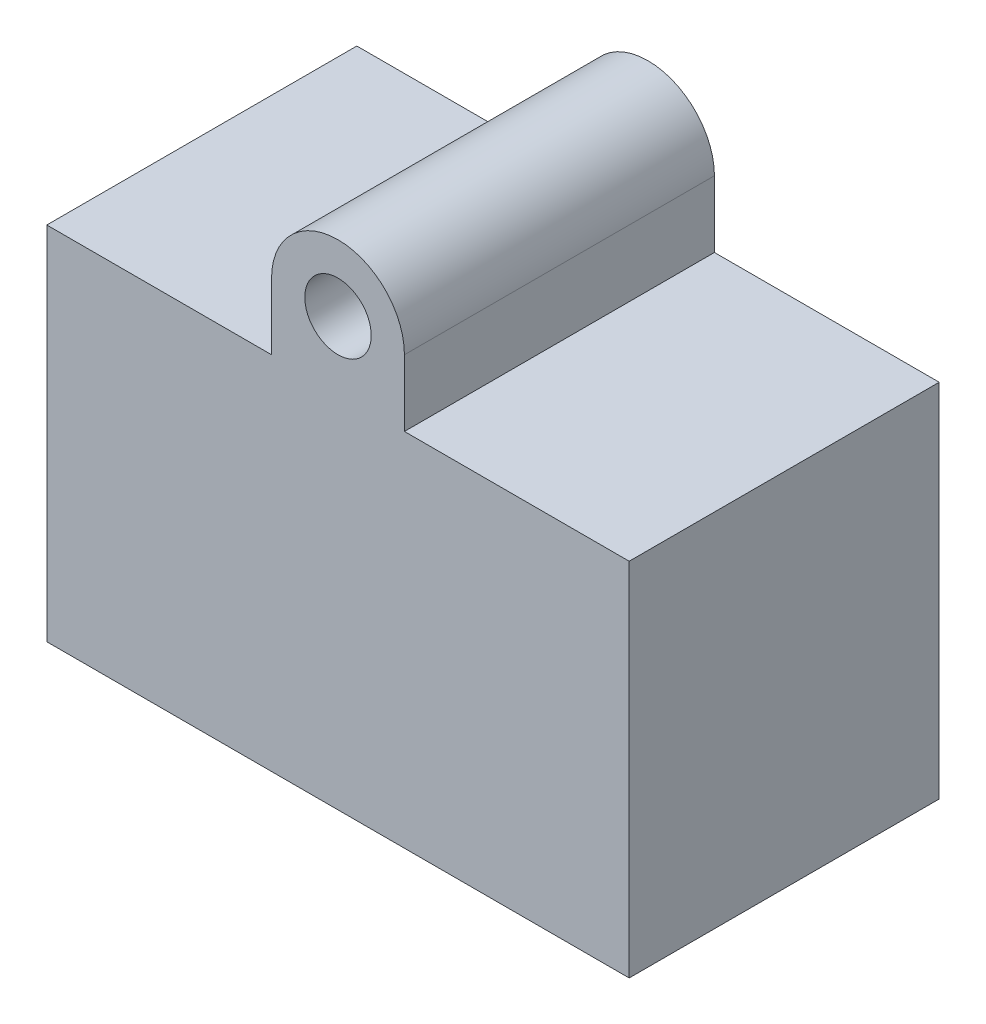
ISO-10303-21;
HEADER;
FILE_DESCRIPTION(('STEP AP214'),'2;1');
FILE_NAME('part.step','',(''),(''),'','','');
FILE_SCHEMA(('AUTOMOTIVE_DESIGN { 1 0 10303 214 1 1 1 1 }'));
ENDSEC;
DATA;
#1=APPLICATION_CONTEXT('core data for automotive mechanical design processes');
#2=APPLICATION_PROTOCOL_DEFINITION('international standard','automotive_design',2000,#1);
#3=PRODUCT_CONTEXT('',#1,'mechanical');
#4=PRODUCT('Part','Part','',(#3));
#5=PRODUCT_RELATED_PRODUCT_CATEGORY('part','',(#4));
#6=PRODUCT_DEFINITION_FORMATION('','',#4);
#7=PRODUCT_DEFINITION_CONTEXT('part definition',#1,'design');
#8=PRODUCT_DEFINITION('design','',#6,#7);
#9=PRODUCT_DEFINITION_SHAPE('','',#8);
#10=(LENGTH_UNIT() NAMED_UNIT(*) SI_UNIT(.MILLI.,.METRE.));
#11=(NAMED_UNIT(*) PLANE_ANGLE_UNIT() SI_UNIT($,.RADIAN.));
#12=(NAMED_UNIT(*) SI_UNIT($,.STERADIAN.) SOLID_ANGLE_UNIT());
#13=UNCERTAINTY_MEASURE_WITH_UNIT(LENGTH_MEASURE(1.E-05),#10,'distance_accuracy_value','');
#14=(GEOMETRIC_REPRESENTATION_CONTEXT(3) GLOBAL_UNCERTAINTY_ASSIGNED_CONTEXT((#13)) GLOBAL_UNIT_ASSIGNED_CONTEXT((#10,
#11,#12)) REPRESENTATION_CONTEXT('',''));
#15=CARTESIAN_POINT('',(0.,0.,0.));
#16=DIRECTION('',(0.,0.,1.));
#17=DIRECTION('',(1.,0.,0.));
#18=AXIS2_PLACEMENT_3D('',#15,#16,#17);
#19=CARTESIAN_POINT('',(5.07,2.575,7.));
#20=DIRECTION('',(-1.,0.,0.));
#21=DIRECTION('',(0.,0.,1.));
#22=AXIS2_PLACEMENT_3D('',#19,#20,#21);
#23=PLANE('',#22);
#24=DIRECTION('',(0.,0.,-1.));
#25=VECTOR('',#24,1.);
#26=CARTESIAN_POINT('',(5.07,-2.575,7.));
#27=LINE('',#26,#25);
#28=CARTESIAN_POINT('',(5.07,-2.575,5.));
#29=VERTEX_POINT('',#28);
#30=CARTESIAN_POINT('',(5.07,-2.575,0.));
#31=VERTEX_POINT('',#30);
#32=EDGE_CURVE('E60',#29,#31,#27,.T.);
#33=ORIENTED_EDGE('',*,*,#32,.F.);
#34=DIRECTION('',(0.,1.,0.));
#35=VECTOR('',#34,1.);
#36=CARTESIAN_POINT('',(5.07,2.575,5.));
#37=LINE('',#36,#35);
#38=CARTESIAN_POINT('',(5.07,2.575,5.));
#39=VERTEX_POINT('',#38);
#40=EDGE_CURVE('E54',#29,#39,#37,.T.);
#41=ORIENTED_EDGE('',*,*,#40,.T.);
#42=DIRECTION('',(0.,0.,-1.));
#43=VECTOR('',#42,1.);
#44=CARTESIAN_POINT('',(5.07,2.575,7.));
#45=LINE('',#44,#43);
#46=CARTESIAN_POINT('',(5.07,2.575,0.));
#47=VERTEX_POINT('',#46);
#48=EDGE_CURVE('E143',#39,#47,#45,.T.);
#49=ORIENTED_EDGE('',*,*,#48,.T.);
#50=DIRECTION('',(0.,1.,0.));
#51=VECTOR('',#50,1.);
#52=CARTESIAN_POINT('',(5.07,2.575,0.));
#53=LINE('',#52,#51);
#54=EDGE_CURVE('E253',#31,#47,#53,.T.);
#55=ORIENTED_EDGE('',*,*,#54,.F.);
#56=EDGE_LOOP('',(#33,#41,#49,#55));
#57=FACE_BOUND('',#56,.T.);
#58=ADVANCED_FACE('F39',(#57),#23,.T.);
#59=CARTESIAN_POINT('',(-5.08,2.575,7.));
#60=DIRECTION('',(0.,-1.,0.));
#61=DIRECTION('',(0.,0.,-1.));
#62=AXIS2_PLACEMENT_3D('',#59,#60,#61);
#63=PLANE('',#62);
#64=ORIENTED_EDGE('',*,*,#48,.F.);
#65=DIRECTION('',(-1.,0.,0.));
#66=VECTOR('',#65,1.);
#67=CARTESIAN_POINT('',(-5.08,2.575,5.));
#68=LINE('',#67,#66);
#69=CARTESIAN_POINT('',(-5.08,2.575,5.));
#70=VERTEX_POINT('',#69);
#71=EDGE_CURVE('E136',#39,#70,#68,.T.);
#72=ORIENTED_EDGE('',*,*,#71,.T.);
#73=DIRECTION('',(0.,0.,-1.));
#74=VECTOR('',#73,1.);
#75=CARTESIAN_POINT('',(-5.08,2.575,7.));
#76=LINE('',#75,#74);
#77=CARTESIAN_POINT('',(-5.08,2.575,0.));
#78=VERTEX_POINT('',#77);
#79=EDGE_CURVE('E135',#70,#78,#76,.T.);
#80=ORIENTED_EDGE('',*,*,#79,.T.);
#81=DIRECTION('',(-1.,0.,0.));
#82=VECTOR('',#81,1.);
#83=CARTESIAN_POINT('',(-5.08,2.575,0.));
#84=LINE('',#83,#82);
#85=EDGE_CURVE('E257',#47,#78,#84,.T.);
#86=ORIENTED_EDGE('',*,*,#85,.F.);
#87=EDGE_LOOP('',(#64,#72,#80,#86));
#88=FACE_BOUND('',#87,.T.);
#89=ADVANCED_FACE('F271',(#88),#63,.T.);
#90=CARTESIAN_POINT('',(-5.08,2.575,7.));
#91=DIRECTION('',(1.,0.,0.));
#92=DIRECTION('',(0.,0.,-1.));
#93=AXIS2_PLACEMENT_3D('',#90,#91,#92);
#94=PLANE('',#93);
#95=ORIENTED_EDGE('',*,*,#79,.F.);
#96=DIRECTION('',(0.,-1.,0.));
#97=VECTOR('',#96,1.);
#98=CARTESIAN_POINT('',(-5.08,2.575,5.));
#99=LINE('',#98,#97);
#100=CARTESIAN_POINT('',(-5.08,-2.575,5.));
#101=VERTEX_POINT('',#100);
#102=EDGE_CURVE('E127',#70,#101,#99,.T.);
#103=ORIENTED_EDGE('',*,*,#102,.T.);
#104=DIRECTION('',(0.,0.,-1.));
#105=VECTOR('',#104,1.);
#106=CARTESIAN_POINT('',(-5.08,-2.575,7.));
#107=LINE('',#106,#105);
#108=CARTESIAN_POINT('',(-5.08,-2.575,0.));
#109=VERTEX_POINT('',#108);
#110=EDGE_CURVE('E134',#101,#109,#107,.T.);
#111=ORIENTED_EDGE('',*,*,#110,.T.);
#112=DIRECTION('',(0.,-1.,0.));
#113=VECTOR('',#112,1.);
#114=CARTESIAN_POINT('',(-5.08,2.575,0.));
#115=LINE('',#114,#113);
#116=EDGE_CURVE('E266',#78,#109,#115,.T.);
#117=ORIENTED_EDGE('',*,*,#116,.F.);
#118=EDGE_LOOP('',(#95,#103,#111,#117));
#119=FACE_BOUND('',#118,.T.);
#120=ADVANCED_FACE('F132',(#119),#94,.T.);
#121=CARTESIAN_POINT('',(-5.08,-2.575,7.));
#122=DIRECTION('',(0.,1.,0.));
#123=DIRECTION('',(0.,0.,1.));
#124=AXIS2_PLACEMENT_3D('',#121,#122,#123);
#125=PLANE('',#124);
#126=ORIENTED_EDGE('',*,*,#110,.F.);
#127=DIRECTION('',(1.,0.,0.));
#128=VECTOR('',#127,1.);
#129=CARTESIAN_POINT('',(-5.08,-2.575,5.));
#130=LINE('',#129,#128);
#131=EDGE_CURVE('E11',#101,#29,#130,.T.);
#132=ORIENTED_EDGE('',*,*,#131,.T.);
#133=ORIENTED_EDGE('',*,*,#32,.T.);
#134=DIRECTION('',(1.,0.,0.));
#135=VECTOR('',#134,1.);
#136=CARTESIAN_POINT('',(-5.08,-2.575,0.));
#137=LINE('',#136,#135);
#138=EDGE_CURVE('E140',#109,#31,#137,.T.);
#139=ORIENTED_EDGE('',*,*,#138,.F.);
#140=EDGE_LOOP('',(#126,#132,#133,#139));
#141=FACE_BOUND('',#140,.T.);
#142=ADVANCED_FACE('F138',(#141),#125,.T.);
#143=CARTESIAN_POINT('',(-0.0049999999999998,5.575,7.));
#144=DIRECTION('',(0.,0.,1.));
#145=DIRECTION('',(1.,0.,0.));
#146=AXIS2_PLACEMENT_3D('',#143,#144,#145);
#147=PLANE('',#146);
#148=DIRECTION('',(0.,-1.,0.));
#149=VECTOR('',#148,1.);
#150=CARTESIAN_POINT('',(-1.505,5.575,7.));
#151=LINE('',#150,#149);
#152=CARTESIAN_POINT('',(-1.505,5.575,7.));
#153=VERTEX_POINT('',#152);
#154=CARTESIAN_POINT('',(-1.505,4.075,7.));
#155=VERTEX_POINT('',#154);
#156=EDGE_CURVE('E164',#153,#155,#151,.T.);
#157=ORIENTED_EDGE('',*,*,#156,.T.);
#158=DIRECTION('',(-1.,0.,0.));
#159=VECTOR('',#158,1.);
#160=CARTESIAN_POINT('',(-6.58,4.075,7.));
#161=LINE('',#160,#159);
#162=CARTESIAN_POINT('',(-6.58,4.075,7.));
#163=VERTEX_POINT('',#162);
#164=EDGE_CURVE('E166',#155,#163,#161,.T.);
#165=ORIENTED_EDGE('',*,*,#164,.T.);
#166=DIRECTION('',(0.,-1.,0.));
#167=VECTOR('',#166,1.);
#168=CARTESIAN_POINT('',(-6.58,4.075,7.));
#169=LINE('',#168,#167);
#170=CARTESIAN_POINT('',(-6.58,-4.075,7.));
#171=VERTEX_POINT('',#170);
#172=EDGE_CURVE('E150',#163,#171,#169,.T.);
#173=ORIENTED_EDGE('',*,*,#172,.T.);
#174=DIRECTION('',(1.,0.,0.));
#175=VECTOR('',#174,1.);
#176=CARTESIAN_POINT('',(-6.58,-4.075,7.));
#177=LINE('',#176,#175);
#178=CARTESIAN_POINT('',(6.57,-4.075,7.));
#179=VERTEX_POINT('',#178);
#180=EDGE_CURVE('E153',#171,#179,#177,.T.);
#181=ORIENTED_EDGE('',*,*,#180,.T.);
#182=DIRECTION('',(0.,1.,0.));
#183=VECTOR('',#182,1.);
#184=CARTESIAN_POINT('',(6.57,4.075,7.));
#185=LINE('',#184,#183);
#186=CARTESIAN_POINT('',(6.57,4.075,7.));
#187=VERTEX_POINT('',#186);
#188=EDGE_CURVE('E156',#179,#187,#185,.T.);
#189=ORIENTED_EDGE('',*,*,#188,.T.);
#190=DIRECTION('',(-1.,0.,0.));
#191=VECTOR('',#190,1.);
#192=CARTESIAN_POINT('',(1.495,4.075,7.));
#193=LINE('',#192,#191);
#194=CARTESIAN_POINT('',(1.495,4.075,7.));
#195=VERTEX_POINT('',#194);
#196=EDGE_CURVE('E158',#187,#195,#193,.T.);
#197=ORIENTED_EDGE('',*,*,#196,.T.);
#198=DIRECTION('',(0.,1.,0.));
#199=VECTOR('',#198,1.);
#200=CARTESIAN_POINT('',(1.495,5.575,7.));
#201=LINE('',#200,#199);
#202=CARTESIAN_POINT('',(1.495,5.575,7.));
#203=VERTEX_POINT('',#202);
#204=EDGE_CURVE('E160',#195,#203,#201,.T.);
#205=ORIENTED_EDGE('',*,*,#204,.T.);
#206=CARTESIAN_POINT('',(-0.0049999999999998,5.575,7.));
#207=DIRECTION('',(0.,0.,1.));
#208=DIRECTION('',(1.,0.,0.));
#209=AXIS2_PLACEMENT_3D('',#206,#207,#208);
#210=CIRCLE('',#209,1.5);
#211=EDGE_CURVE('E162',#203,#153,#210,.T.);
#212=ORIENTED_EDGE('',*,*,#211,.T.);
#213=EDGE_LOOP('',(#157,#165,#173,#181,#189,#197,#205,#212));
#214=FACE_BOUND('',#213,.T.);
#215=CARTESIAN_POINT('',(-0.0049999999999998,5.575,7.));
#216=DIRECTION('',(0.,0.,1.));
#217=DIRECTION('',(1.,0.,0.));
#218=AXIS2_PLACEMENT_3D('',#215,#216,#217);
#219=CIRCLE('',#218,0.75);
#220=CARTESIAN_POINT('',(0.745,5.575,7.));
#221=VERTEX_POINT('',#220);
#222=EDGE_CURVE('E251',#221,#221,#219,.T.);
#223=ORIENTED_EDGE('',*,*,#222,.F.);
#224=EDGE_LOOP('',(#223));
#225=FACE_BOUND('',#224,.T.);
#226=ADVANCED_FACE('F245',(#214,#225),#147,.T.);
#227=CARTESIAN_POINT('',(-0.0049999999999998,5.575,0.));
#228=DIRECTION('',(0.,0.,1.));
#229=DIRECTION('',(1.,0.,0.));
#230=AXIS2_PLACEMENT_3D('',#227,#228,#229);
#231=PLANE('',#230);
#232=DIRECTION('',(0.,-1.,0.));
#233=VECTOR('',#232,1.);
#234=CARTESIAN_POINT('',(-6.58,4.075,0.));
#235=LINE('',#234,#233);
#236=CARTESIAN_POINT('',(-6.58,4.075,0.));
#237=VERTEX_POINT('',#236);
#238=CARTESIAN_POINT('',(-6.58,-4.075,0.));
#239=VERTEX_POINT('',#238);
#240=EDGE_CURVE('E149',#237,#239,#235,.T.);
#241=ORIENTED_EDGE('',*,*,#240,.F.);
#242=DIRECTION('',(-1.,0.,0.));
#243=VECTOR('',#242,1.);
#244=CARTESIAN_POINT('',(-6.58,4.075,0.));
#245=LINE('',#244,#243);
#246=CARTESIAN_POINT('',(-1.505,4.075,0.));
#247=VERTEX_POINT('',#246);
#248=EDGE_CURVE('E154',#247,#237,#245,.T.);
#249=ORIENTED_EDGE('',*,*,#248,.F.);
#250=DIRECTION('',(0.,-1.,0.));
#251=VECTOR('',#250,1.);
#252=CARTESIAN_POINT('',(-1.505,5.575,0.));
#253=LINE('',#252,#251);
#254=CARTESIAN_POINT('',(-1.505,5.575,0.));
#255=VERTEX_POINT('',#254);
#256=EDGE_CURVE('E184',#255,#247,#253,.T.);
#257=ORIENTED_EDGE('',*,*,#256,.F.);
#258=CARTESIAN_POINT('',(-0.0049999999999998,5.575,0.));
#259=DIRECTION('',(0.,0.,1.));
#260=DIRECTION('',(1.,0.,0.));
#261=AXIS2_PLACEMENT_3D('',#258,#259,#260);
#262=CIRCLE('',#261,1.5);
#263=CARTESIAN_POINT('',(1.495,5.575,0.));
#264=VERTEX_POINT('',#263);
#265=EDGE_CURVE('E182',#264,#255,#262,.T.);
#266=ORIENTED_EDGE('',*,*,#265,.F.);
#267=DIRECTION('',(0.,1.,0.));
#268=VECTOR('',#267,1.);
#269=CARTESIAN_POINT('',(1.495,5.575,0.));
#270=LINE('',#269,#268);
#271=CARTESIAN_POINT('',(1.495,4.075,0.));
#272=VERTEX_POINT('',#271);
#273=EDGE_CURVE('E180',#272,#264,#270,.T.);
#274=ORIENTED_EDGE('',*,*,#273,.F.);
#275=DIRECTION('',(-1.,0.,0.));
#276=VECTOR('',#275,1.);
#277=CARTESIAN_POINT('',(1.495,4.075,0.));
#278=LINE('',#277,#276);
#279=CARTESIAN_POINT('',(6.57,4.075,0.));
#280=VERTEX_POINT('',#279);
#281=EDGE_CURVE('E177',#280,#272,#278,.T.);
#282=ORIENTED_EDGE('',*,*,#281,.F.);
#283=DIRECTION('',(0.,1.,0.));
#284=VECTOR('',#283,1.);
#285=CARTESIAN_POINT('',(6.57,4.075,0.));
#286=LINE('',#285,#284);
#287=CARTESIAN_POINT('',(6.57,-4.075,0.));
#288=VERTEX_POINT('',#287);
#289=EDGE_CURVE('E174',#288,#280,#286,.T.);
#290=ORIENTED_EDGE('',*,*,#289,.F.);
#291=DIRECTION('',(1.,0.,0.));
#292=VECTOR('',#291,1.);
#293=CARTESIAN_POINT('',(-6.58,-4.075,0.));
#294=LINE('',#293,#292);
#295=EDGE_CURVE('E171',#239,#288,#294,.T.);
#296=ORIENTED_EDGE('',*,*,#295,.F.);
#297=EDGE_LOOP('',(#241,#249,#257,#266,#274,#282,#290,#296));
#298=FACE_BOUND('',#297,.T.);
#299=ORIENTED_EDGE('',*,*,#54,.T.);
#300=ORIENTED_EDGE('',*,*,#85,.T.);
#301=ORIENTED_EDGE('',*,*,#116,.T.);
#302=ORIENTED_EDGE('',*,*,#138,.T.);
#303=EDGE_LOOP('',(#299,#300,#301,#302));
#304=FACE_BOUND('',#303,.T.);
#305=CARTESIAN_POINT('',(-0.0049999999999998,5.575,0.));
#306=DIRECTION('',(0.,0.,1.));
#307=DIRECTION('',(1.,0.,0.));
#308=AXIS2_PLACEMENT_3D('',#305,#306,#307);
#309=CIRCLE('',#308,0.75);
#310=CARTESIAN_POINT('',(0.745,5.575,0.));
#311=VERTEX_POINT('',#310);
#312=EDGE_CURVE('E254',#311,#311,#309,.T.);
#313=ORIENTED_EDGE('',*,*,#312,.T.);
#314=EDGE_LOOP('',(#313));
#315=FACE_BOUND('',#314,.T.);
#316=ADVANCED_FACE('F213',(#298,#304,#315),#231,.F.);
#317=CARTESIAN_POINT('',(-6.58,4.075,7.));
#318=DIRECTION('',(1.,0.,0.));
#319=DIRECTION('',(0.,0.,-1.));
#320=AXIS2_PLACEMENT_3D('',#317,#318,#319);
#321=PLANE('',#320);
#322=DIRECTION('',(0.,0.,-1.));
#323=VECTOR('',#322,1.);
#324=CARTESIAN_POINT('',(-6.58,4.075,7.));
#325=LINE('',#324,#323);
#326=EDGE_CURVE('E168',#163,#237,#325,.T.);
#327=ORIENTED_EDGE('',*,*,#326,.T.);
#328=ORIENTED_EDGE('',*,*,#240,.T.);
#329=DIRECTION('',(0.,0.,-1.));
#330=VECTOR('',#329,1.);
#331=CARTESIAN_POINT('',(-6.58,-4.075,7.));
#332=LINE('',#331,#330);
#333=EDGE_CURVE('E47',#171,#239,#332,.T.);
#334=ORIENTED_EDGE('',*,*,#333,.F.);
#335=ORIENTED_EDGE('',*,*,#172,.F.);
#336=EDGE_LOOP('',(#327,#328,#334,#335));
#337=FACE_BOUND('',#336,.T.);
#338=ADVANCED_FACE('F41',(#337),#321,.F.);
#339=CARTESIAN_POINT('',(-6.58,-4.075,7.));
#340=DIRECTION('',(0.,1.,0.));
#341=DIRECTION('',(0.,0.,1.));
#342=AXIS2_PLACEMENT_3D('',#339,#340,#341);
#343=PLANE('',#342);
#344=ORIENTED_EDGE('',*,*,#333,.T.);
#345=ORIENTED_EDGE('',*,*,#295,.T.);
#346=DIRECTION('',(0.,0.,-1.));
#347=VECTOR('',#346,1.);
#348=CARTESIAN_POINT('',(6.57,-4.075,7.));
#349=LINE('',#348,#347);
#350=EDGE_CURVE('E202',#179,#288,#349,.T.);
#351=ORIENTED_EDGE('',*,*,#350,.F.);
#352=ORIENTED_EDGE('',*,*,#180,.F.);
#353=EDGE_LOOP('',(#344,#345,#351,#352));
#354=FACE_BOUND('',#353,.T.);
#355=ADVANCED_FACE('F206',(#354),#343,.F.);
#356=CARTESIAN_POINT('',(6.57,4.075,7.));
#357=DIRECTION('',(-1.,0.,0.));
#358=DIRECTION('',(0.,0.,1.));
#359=AXIS2_PLACEMENT_3D('',#356,#357,#358);
#360=PLANE('',#359);
#361=ORIENTED_EDGE('',*,*,#350,.T.);
#362=ORIENTED_EDGE('',*,*,#289,.T.);
#363=DIRECTION('',(0.,0.,-1.));
#364=VECTOR('',#363,1.);
#365=CARTESIAN_POINT('',(6.57,4.075,7.));
#366=LINE('',#365,#364);
#367=EDGE_CURVE('E200',#187,#280,#366,.T.);
#368=ORIENTED_EDGE('',*,*,#367,.F.);
#369=ORIENTED_EDGE('',*,*,#188,.F.);
#370=EDGE_LOOP('',(#361,#362,#368,#369));
#371=FACE_BOUND('',#370,.T.);
#372=ADVANCED_FACE('F243',(#371),#360,.F.);
#373=CARTESIAN_POINT('',(1.495,4.075,7.));
#374=DIRECTION('',(0.,-1.,0.));
#375=DIRECTION('',(0.,0.,-1.));
#376=AXIS2_PLACEMENT_3D('',#373,#374,#375);
#377=PLANE('',#376);
#378=ORIENTED_EDGE('',*,*,#367,.T.);
#379=ORIENTED_EDGE('',*,*,#281,.T.);
#380=DIRECTION('',(0.,0.,-1.));
#381=VECTOR('',#380,1.);
#382=CARTESIAN_POINT('',(1.495,4.075,7.));
#383=LINE('',#382,#381);
#384=EDGE_CURVE('E198',#195,#272,#383,.T.);
#385=ORIENTED_EDGE('',*,*,#384,.F.);
#386=ORIENTED_EDGE('',*,*,#196,.F.);
#387=EDGE_LOOP('',(#378,#379,#385,#386));
#388=FACE_BOUND('',#387,.T.);
#389=ADVANCED_FACE('F238',(#388),#377,.F.);
#390=CARTESIAN_POINT('',(1.495,5.575,7.));
#391=DIRECTION('',(-1.,0.,0.));
#392=DIRECTION('',(0.,0.,1.));
#393=AXIS2_PLACEMENT_3D('',#390,#391,#392);
#394=PLANE('',#393);
#395=ORIENTED_EDGE('',*,*,#273,.T.);
#396=DIRECTION('',(0.,0.,-1.));
#397=VECTOR('',#396,1.);
#398=CARTESIAN_POINT('',(1.495,5.575,7.));
#399=LINE('',#398,#397);
#400=EDGE_CURVE('E195',#203,#264,#399,.T.);
#401=ORIENTED_EDGE('',*,*,#400,.F.);
#402=ORIENTED_EDGE('',*,*,#204,.F.);
#403=ORIENTED_EDGE('',*,*,#384,.T.);
#404=EDGE_LOOP('',(#395,#401,#402,#403));
#405=FACE_BOUND('',#404,.T.);
#406=ADVANCED_FACE('F235',(#405),#394,.F.);
#407=CARTESIAN_POINT('',(-0.0049999999999998,5.575,7.));
#408=DIRECTION('',(0.,0.,-1.));
#409=DIRECTION('',(-1.,0.,0.));
#410=AXIS2_PLACEMENT_3D('',#407,#408,#409);
#411=CYLINDRICAL_SURFACE('',#410,1.5);
#412=ORIENTED_EDGE('',*,*,#265,.T.);
#413=DIRECTION('',(0.,0.,-1.));
#414=VECTOR('',#413,1.);
#415=CARTESIAN_POINT('',(-1.505,5.575,7.));
#416=LINE('',#415,#414);
#417=EDGE_CURVE('E192',#153,#255,#416,.T.);
#418=ORIENTED_EDGE('',*,*,#417,.F.);
#419=ORIENTED_EDGE('',*,*,#211,.F.);
#420=ORIENTED_EDGE('',*,*,#400,.T.);
#421=EDGE_LOOP('',(#412,#418,#419,#420));
#422=FACE_BOUND('',#421,.T.);
#423=ADVANCED_FACE('F231',(#422),#411,.T.);
#424=CARTESIAN_POINT('',(-1.505,5.575,7.));
#425=DIRECTION('',(1.,0.,0.));
#426=DIRECTION('',(0.,1.,0.));
#427=AXIS2_PLACEMENT_3D('',#424,#425,#426);
#428=PLANE('',#427);
#429=ORIENTED_EDGE('',*,*,#256,.T.);
#430=DIRECTION('',(0.,0.,-1.));
#431=VECTOR('',#430,1.);
#432=CARTESIAN_POINT('',(-1.505,4.075,7.));
#433=LINE('',#432,#431);
#434=EDGE_CURVE('E190',#155,#247,#433,.T.);
#435=ORIENTED_EDGE('',*,*,#434,.F.);
#436=ORIENTED_EDGE('',*,*,#156,.F.);
#437=ORIENTED_EDGE('',*,*,#417,.T.);
#438=EDGE_LOOP('',(#429,#435,#436,#437));
#439=FACE_BOUND('',#438,.T.);
#440=ADVANCED_FACE('F226',(#439),#428,.F.);
#441=CARTESIAN_POINT('',(-6.58,4.075,7.));
#442=DIRECTION('',(0.,-1.,0.));
#443=DIRECTION('',(0.,0.,-1.));
#444=AXIS2_PLACEMENT_3D('',#441,#442,#443);
#445=PLANE('',#444);
#446=ORIENTED_EDGE('',*,*,#434,.T.);
#447=ORIENTED_EDGE('',*,*,#248,.T.);
#448=ORIENTED_EDGE('',*,*,#326,.F.);
#449=ORIENTED_EDGE('',*,*,#164,.F.);
#450=EDGE_LOOP('',(#446,#447,#448,#449));
#451=FACE_BOUND('',#450,.T.);
#452=ADVANCED_FACE('F220',(#451),#445,.F.);
#453=CARTESIAN_POINT('',(-0.0049999999999998,5.575,7.));
#454=DIRECTION('',(0.,0.,-1.));
#455=DIRECTION('',(-1.,0.,0.));
#456=AXIS2_PLACEMENT_3D('',#453,#454,#455);
#457=CYLINDRICAL_SURFACE('',#456,0.75);
#458=ORIENTED_EDGE('',*,*,#222,.T.);
#459=EDGE_LOOP('',(#458));
#460=FACE_BOUND('',#459,.T.);
#461=ORIENTED_EDGE('',*,*,#312,.F.);
#462=EDGE_LOOP('',(#461));
#463=FACE_BOUND('',#462,.T.);
#464=ADVANCED_FACE('F286',(#460,#463),#457,.F.);
#465=CARTESIAN_POINT('',(0.,0.,5.));
#466=DIRECTION('',(0.,0.,1.));
#467=DIRECTION('',(1.,0.,0.));
#468=AXIS2_PLACEMENT_3D('',#465,#466,#467);
#469=PLANE('',#468);
#470=ORIENTED_EDGE('',*,*,#40,.F.);
#471=ORIENTED_EDGE('',*,*,#131,.F.);
#472=ORIENTED_EDGE('',*,*,#102,.F.);
#473=ORIENTED_EDGE('',*,*,#71,.F.);
#474=EDGE_LOOP('',(#470,#471,#472,#473));
#475=FACE_BOUND('',#474,.T.);
#476=ADVANCED_FACE('F126',(#475),#469,.F.);
#477=CLOSED_SHELL('',(#58,#89,#120,#142,#226,#316,#338,#355,#372,#389,#406,#423,#440,#452,#464,#476));
#478=MANIFOLD_SOLID_BREP('B2',#477);
#479=ADVANCED_BREP_SHAPE_REPRESENTATION('',(#18,#478),#14);
#480=SHAPE_DEFINITION_REPRESENTATION(#9,#479);
ENDSEC;
END-ISO-10303-21;
